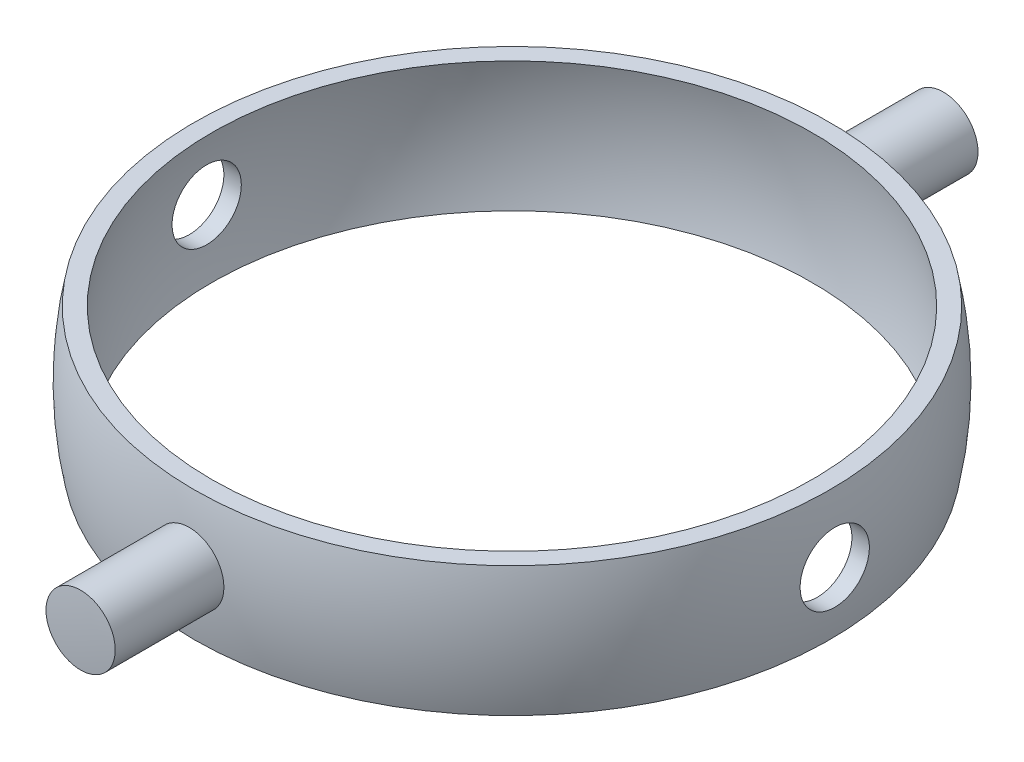
ISO-10303-21;
HEADER;
FILE_DESCRIPTION(('STEP AP214'),'2;1');
FILE_NAME('part.step','',(''),(''),'','','');
FILE_SCHEMA(('AUTOMOTIVE_DESIGN { 1 0 10303 214 1 1 1 1 }'));
ENDSEC;
DATA;
#1=APPLICATION_CONTEXT('core data for automotive mechanical design processes');
#2=APPLICATION_PROTOCOL_DEFINITION('international standard','automotive_design',2000,#1);
#3=PRODUCT_CONTEXT('',#1,'mechanical');
#4=PRODUCT('Part','Part','',(#3));
#5=PRODUCT_RELATED_PRODUCT_CATEGORY('part','',(#4));
#6=PRODUCT_DEFINITION_FORMATION('','',#4);
#7=PRODUCT_DEFINITION_CONTEXT('part definition',#1,'design');
#8=PRODUCT_DEFINITION('design','',#6,#7);
#9=PRODUCT_DEFINITION_SHAPE('','',#8);
#10=(LENGTH_UNIT() NAMED_UNIT(*) SI_UNIT(.MILLI.,.METRE.));
#11=(NAMED_UNIT(*) PLANE_ANGLE_UNIT() SI_UNIT($,.RADIAN.));
#12=(NAMED_UNIT(*) SI_UNIT($,.STERADIAN.) SOLID_ANGLE_UNIT());
#13=UNCERTAINTY_MEASURE_WITH_UNIT(LENGTH_MEASURE(1.E-05),#10,'distance_accuracy_value','');
#14=(GEOMETRIC_REPRESENTATION_CONTEXT(3) GLOBAL_UNCERTAINTY_ASSIGNED_CONTEXT((#13)) GLOBAL_UNIT_ASSIGNED_CONTEXT((#10,
#11,#12)) REPRESENTATION_CONTEXT('',''));
#15=CARTESIAN_POINT('',(0.,0.,0.));
#16=DIRECTION('',(0.,0.,1.));
#17=DIRECTION('',(1.,0.,0.));
#18=AXIS2_PLACEMENT_3D('',#15,#16,#17);
#19=CARTESIAN_POINT('',(0.,0.,0.));
#20=DIRECTION('',(0.,1.,0.));
#21=DIRECTION('',(-1.,0.,0.));
#22=AXIS2_PLACEMENT_3D('',#19,#20,#21);
#23=SPHERICAL_SURFACE('',#22,37.5);
#24=CARTESIAN_POINT('',(0.,7.5,0.));
#25=DIRECTION('',(0.,1.,0.));
#26=DIRECTION('',(0.,0.,1.));
#27=AXIS2_PLACEMENT_3D('',#24,#25,#26);
#28=CIRCLE('',#27,36.7423461417477);
#29=CARTESIAN_POINT('',(0.,7.5,36.7423461417477));
#30=VERTEX_POINT('',#29);
#31=EDGE_CURVE('E84',#30,#30,#28,.T.);
#32=ORIENTED_EDGE('',*,*,#31,.F.);
#33=EDGE_LOOP('',(#32));
#34=FACE_BOUND('',#33,.T.);
#35=CARTESIAN_POINT('',(0.,-7.5,0.));
#36=DIRECTION('',(0.,1.,0.));
#37=DIRECTION('',(0.,0.,1.));
#38=AXIS2_PLACEMENT_3D('',#35,#36,#37);
#39=CIRCLE('',#38,36.7423461417477);
#40=CARTESIAN_POINT('',(0.,-7.5,36.7423461417477));
#41=VERTEX_POINT('',#40);
#42=EDGE_CURVE('E47',#41,#41,#39,.T.);
#43=ORIENTED_EDGE('',*,*,#42,.T.);
#44=EDGE_LOOP('',(#43));
#45=FACE_BOUND('',#44,.T.);
#46=CARTESIAN_POINT('',(-37.2860563750043,0.,0.));
#47=DIRECTION('',(1.,0.,0.));
#48=DIRECTION('',(0.,0.,-1.));
#49=AXIS2_PLACEMENT_3D('',#46,#47,#48);
#50=CIRCLE('',#49,4.);
#51=CARTESIAN_POINT('',(-37.2860563750043,0.,-4.));
#52=VERTEX_POINT('',#51);
#53=EDGE_CURVE('E75',#52,#52,#50,.F.);
#54=ORIENTED_EDGE('',*,*,#53,.F.);
#55=EDGE_LOOP('',(#54));
#56=FACE_BOUND('',#55,.T.);
#57=CARTESIAN_POINT('',(37.2860563750043,0.,0.));
#58=DIRECTION('',(-1.,0.,0.));
#59=DIRECTION('',(0.,0.,1.));
#60=AXIS2_PLACEMENT_3D('',#57,#58,#59);
#61=CIRCLE('',#60,4.);
#62=CARTESIAN_POINT('',(37.2860563750043,0.,4.));
#63=VERTEX_POINT('',#62);
#64=EDGE_CURVE('E79',#63,#63,#61,.F.);
#65=ORIENTED_EDGE('',*,*,#64,.F.);
#66=EDGE_LOOP('',(#65));
#67=FACE_BOUND('',#66,.T.);
#68=CARTESIAN_POINT('',(0.,0.,37.2860563750043));
#69=DIRECTION('',(0.,0.,-1.));
#70=DIRECTION('',(-1.,0.,0.));
#71=AXIS2_PLACEMENT_3D('',#68,#69,#70);
#72=CIRCLE('',#71,4.);
#73=CARTESIAN_POINT('',(-4.,0.,37.2860563750043));
#74=VERTEX_POINT('',#73);
#75=EDGE_CURVE('E11',#74,#74,#72,.F.);
#76=ORIENTED_EDGE('',*,*,#75,.F.);
#77=EDGE_LOOP('',(#76));
#78=FACE_BOUND('',#77,.T.);
#79=CARTESIAN_POINT('',(0.,0.,-37.2860563750043));
#80=DIRECTION('',(0.,0.,1.));
#81=DIRECTION('',(1.,0.,0.));
#82=AXIS2_PLACEMENT_3D('',#79,#80,#81);
#83=CIRCLE('',#82,4.);
#84=CARTESIAN_POINT('',(4.,0.,-37.2860563750043));
#85=VERTEX_POINT('',#84);
#86=EDGE_CURVE('E66',#85,#85,#83,.F.);
#87=ORIENTED_EDGE('',*,*,#86,.F.);
#88=EDGE_LOOP('',(#87));
#89=FACE_BOUND('',#88,.T.);
#90=ADVANCED_FACE('F38',(#34,#45,#56,#67,#78,#89),#23,.T.);
#91=CARTESIAN_POINT('',(-36.7423461417477,-7.5,0.));
#92=DIRECTION('',(0.,-1.,0.));
#93=DIRECTION('',(0.,0.,-1.));
#94=AXIS2_PLACEMENT_3D('',#91,#92,#93);
#95=PLANE('',#94);
#96=CARTESIAN_POINT('',(0.,-7.49999999999999,0.));
#97=DIRECTION('',(0.,1.,0.));
#98=DIRECTION('',(0.,0.,1.));
#99=AXIS2_PLACEMENT_3D('',#96,#97,#98);
#100=CIRCLE('',#99,34.6987031457949);
#101=CARTESIAN_POINT('',(0.,-7.49999999999999,34.6987031457949));
#102=VERTEX_POINT('',#101);
#103=EDGE_CURVE('E92',#102,#102,#100,.T.);
#104=ORIENTED_EDGE('',*,*,#103,.T.);
#105=EDGE_LOOP('',(#104));
#106=FACE_BOUND('',#105,.T.);
#107=ORIENTED_EDGE('',*,*,#42,.F.);
#108=EDGE_LOOP('',(#107));
#109=FACE_BOUND('',#108,.T.);
#110=ADVANCED_FACE('F112',(#106,#109),#95,.T.);
#111=CARTESIAN_POINT('',(0.,0.,0.));
#112=DIRECTION('',(0.,1.,0.));
#113=DIRECTION('',(-1.,0.,0.));
#114=AXIS2_PLACEMENT_3D('',#111,#112,#113);
#115=SPHERICAL_SURFACE('',#114,35.5);
#116=CARTESIAN_POINT('',(35.2739280489145,0.,0.));
#117=DIRECTION('',(-1.,0.,0.));
#118=DIRECTION('',(0.,0.,1.));
#119=AXIS2_PLACEMENT_3D('',#116,#117,#118);
#120=CIRCLE('',#119,4.);
#121=CARTESIAN_POINT('',(35.2739280489145,0.,4.));
#122=VERTEX_POINT('',#121);
#123=EDGE_CURVE('E80',#122,#122,#120,.T.);
#124=ORIENTED_EDGE('',*,*,#123,.F.);
#125=EDGE_LOOP('',(#124));
#126=FACE_BOUND('',#125,.T.);
#127=CARTESIAN_POINT('',(-35.2739280489145,0.,0.));
#128=DIRECTION('',(1.,0.,0.));
#129=DIRECTION('',(0.,0.,-1.));
#130=AXIS2_PLACEMENT_3D('',#127,#128,#129);
#131=CIRCLE('',#130,4.);
#132=CARTESIAN_POINT('',(-35.2739280489145,0.,-4.));
#133=VERTEX_POINT('',#132);
#134=EDGE_CURVE('E72',#133,#133,#131,.T.);
#135=ORIENTED_EDGE('',*,*,#134,.F.);
#136=EDGE_LOOP('',(#135));
#137=FACE_BOUND('',#136,.T.);
#138=CARTESIAN_POINT('',(0.,7.5,0.));
#139=DIRECTION('',(0.,1.,0.));
#140=DIRECTION('',(0.,0.,1.));
#141=AXIS2_PLACEMENT_3D('',#138,#139,#140);
#142=CIRCLE('',#141,34.6987031457949);
#143=CARTESIAN_POINT('',(0.,7.5,34.6987031457949));
#144=VERTEX_POINT('',#143);
#145=EDGE_CURVE('E88',#144,#144,#142,.T.);
#146=ORIENTED_EDGE('',*,*,#145,.T.);
#147=EDGE_LOOP('',(#146));
#148=FACE_BOUND('',#147,.T.);
#149=ORIENTED_EDGE('',*,*,#103,.F.);
#150=EDGE_LOOP('',(#149));
#151=FACE_BOUND('',#150,.T.);
#152=ADVANCED_FACE('F108',(#126,#137,#148,#151),#115,.F.);
#153=CARTESIAN_POINT('',(-36.7423461417477,7.5,0.));
#154=DIRECTION('',(0.,1.,0.));
#155=DIRECTION('',(0.,0.,1.));
#156=AXIS2_PLACEMENT_3D('',#153,#154,#155);
#157=PLANE('',#156);
#158=ORIENTED_EDGE('',*,*,#31,.T.);
#159=EDGE_LOOP('',(#158));
#160=FACE_BOUND('',#159,.T.);
#161=ORIENTED_EDGE('',*,*,#145,.F.);
#162=EDGE_LOOP('',(#161));
#163=FACE_BOUND('',#162,.T.);
#164=ADVANCED_FACE('F111',(#160,#163),#157,.T.);
#165=CARTESIAN_POINT('',(-37.5,0.,0.));
#166=DIRECTION('',(1.,0.,0.));
#167=DIRECTION('',(0.,0.,-1.));
#168=AXIS2_PLACEMENT_3D('',#165,#166,#167);
#169=CYLINDRICAL_SURFACE('',#168,4.);
#170=ORIENTED_EDGE('',*,*,#53,.T.);
#171=EDGE_LOOP('',(#170));
#172=FACE_BOUND('',#171,.T.);
#173=ORIENTED_EDGE('',*,*,#134,.T.);
#174=EDGE_LOOP('',(#173));
#175=FACE_BOUND('',#174,.T.);
#176=ADVANCED_FACE('F144',(#172,#175),#169,.F.);
#177=ORIENTED_EDGE('',*,*,#64,.T.);
#178=EDGE_LOOP('',(#177));
#179=FACE_BOUND('',#178,.T.);
#180=ORIENTED_EDGE('',*,*,#123,.T.);
#181=EDGE_LOOP('',(#180));
#182=FACE_BOUND('',#181,.T.);
#183=ADVANCED_FACE('F106',(#179,#182),#169,.F.);
#184=CARTESIAN_POINT('',(0.,0.,-37.501));
#185=DIRECTION('',(0.,0.,1.));
#186=DIRECTION('',(1.,0.,0.));
#187=AXIS2_PLACEMENT_3D('',#184,#185,#186);
#188=CYLINDRICAL_SURFACE('',#187,4.);
#189=CARTESIAN_POINT('',(0.,0.,49.8397431775085));
#190=DIRECTION('',(0.,0.,-1.));
#191=DIRECTION('',(-1.,0.,0.));
#192=AXIS2_PLACEMENT_3D('',#189,#190,#191);
#193=CIRCLE('',#192,4.);
#194=CARTESIAN_POINT('',(-4.,0.,49.8397431775085));
#195=VERTEX_POINT('',#194);
#196=EDGE_CURVE('E63',#195,#195,#193,.F.);
#197=ORIENTED_EDGE('',*,*,#196,.F.);
#198=EDGE_LOOP('',(#197));
#199=FACE_BOUND('',#198,.T.);
#200=ORIENTED_EDGE('',*,*,#75,.T.);
#201=EDGE_LOOP('',(#200));
#202=FACE_BOUND('',#201,.T.);
#203=ADVANCED_FACE('F136',(#199,#202),#188,.T.);
#204=CARTESIAN_POINT('',(0.,0.,50.001));
#205=DIRECTION('',(0.,0.,-1.));
#206=DIRECTION('',(-1.,0.,0.));
#207=AXIS2_PLACEMENT_3D('',#204,#205,#206);
#208=CYLINDRICAL_SURFACE('',#207,4.);
#209=CARTESIAN_POINT('',(0.,0.,-49.8397431775085));
#210=DIRECTION('',(0.,0.,1.));
#211=DIRECTION('',(1.,0.,0.));
#212=AXIS2_PLACEMENT_3D('',#209,#210,#211);
#213=CIRCLE('',#212,4.);
#214=CARTESIAN_POINT('',(4.,0.,-49.8397431775085));
#215=VERTEX_POINT('',#214);
#216=EDGE_CURVE('E41',#215,#215,#213,.T.);
#217=ORIENTED_EDGE('',*,*,#216,.T.);
#218=EDGE_LOOP('',(#217));
#219=FACE_BOUND('',#218,.T.);
#220=ORIENTED_EDGE('',*,*,#86,.T.);
#221=EDGE_LOOP('',(#220));
#222=FACE_BOUND('',#221,.T.);
#223=ADVANCED_FACE('F57',(#219,#222),#208,.T.);
#224=CARTESIAN_POINT('',(0.,0.,0.));
#225=DIRECTION('',(0.,1.,0.));
#226=DIRECTION('',(0.,0.,1.));
#227=AXIS2_PLACEMENT_3D('',#224,#225,#226);
#228=SPHERICAL_SURFACE('',#227,50.);
#229=CARTESIAN_POINT('',(0.,0.,-50.));
#230=VERTEX_POINT('',#229);
#231=VERTEX_LOOP('',#230);
#232=FACE_BOUND('',#231,.T.);
#233=ORIENTED_EDGE('',*,*,#216,.F.);
#234=EDGE_LOOP('',(#233));
#235=FACE_BOUND('',#234,.T.);
#236=ADVANCED_FACE('F53',(#232,#235),#228,.T.);
#237=CARTESIAN_POINT('',(0.,0.,50.));
#238=VERTEX_POINT('',#237);
#239=VERTEX_LOOP('',#238);
#240=FACE_BOUND('',#239,.T.);
#241=ORIENTED_EDGE('',*,*,#196,.T.);
#242=EDGE_LOOP('',(#241));
#243=FACE_BOUND('',#242,.T.);
#244=ADVANCED_FACE('F56',(#240,#243),#228,.T.);
#245=CLOSED_SHELL('',(#90,#110,#152,#164,#176,#183,#203,#223,#236,#244));
#246=MANIFOLD_SOLID_BREP('B2',#245);
#247=ADVANCED_BREP_SHAPE_REPRESENTATION('',(#18,#246),#14);
#248=SHAPE_DEFINITION_REPRESENTATION(#9,#247);
ENDSEC;
END-ISO-10303-21;
